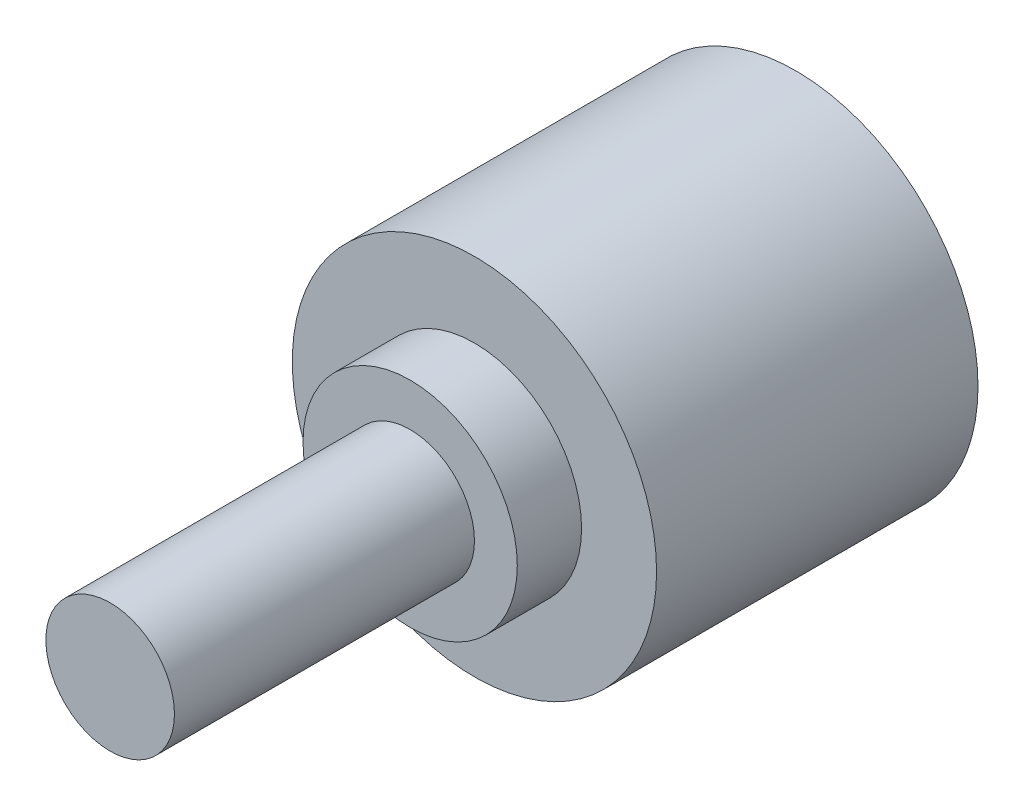
ISO-10303-21;
HEADER;
FILE_DESCRIPTION(('STEP AP214'),'2;1');
FILE_NAME('part.step','',(''),(''),'','','');
FILE_SCHEMA(('AUTOMOTIVE_DESIGN { 1 0 10303 214 1 1 1 1 }'));
ENDSEC;
DATA;
#1=APPLICATION_CONTEXT('core data for automotive mechanical design processes');
#2=APPLICATION_PROTOCOL_DEFINITION('international standard','automotive_design',2000,#1);
#3=PRODUCT_CONTEXT('',#1,'mechanical');
#4=PRODUCT('Part','Part','',(#3));
#5=PRODUCT_RELATED_PRODUCT_CATEGORY('part','',(#4));
#6=PRODUCT_DEFINITION_FORMATION('','',#4);
#7=PRODUCT_DEFINITION_CONTEXT('part definition',#1,'design');
#8=PRODUCT_DEFINITION('design','',#6,#7);
#9=PRODUCT_DEFINITION_SHAPE('','',#8);
#10=(LENGTH_UNIT() NAMED_UNIT(*) SI_UNIT(.MILLI.,.METRE.));
#11=(NAMED_UNIT(*) PLANE_ANGLE_UNIT() SI_UNIT($,.RADIAN.));
#12=(NAMED_UNIT(*) SI_UNIT($,.STERADIAN.) SOLID_ANGLE_UNIT());
#13=UNCERTAINTY_MEASURE_WITH_UNIT(LENGTH_MEASURE(1.E-05),#10,'distance_accuracy_value','');
#14=(GEOMETRIC_REPRESENTATION_CONTEXT(3) GLOBAL_UNCERTAINTY_ASSIGNED_CONTEXT((#13)) GLOBAL_UNIT_ASSIGNED_CONTEXT((#10,
#11,#12)) REPRESENTATION_CONTEXT('',''));
#15=CARTESIAN_POINT('',(0.,0.,0.));
#16=DIRECTION('',(0.,0.,1.));
#17=DIRECTION('',(1.,0.,0.));
#18=AXIS2_PLACEMENT_3D('',#15,#16,#17);
#19=CARTESIAN_POINT('',(0.,0.,14.));
#20=DIRECTION('',(0.,0.,-1.));
#21=DIRECTION('',(-1.,0.,0.));
#22=AXIS2_PLACEMENT_3D('',#19,#20,#21);
#23=CYLINDRICAL_SURFACE('',#22,3.);
#24=CARTESIAN_POINT('',(0.,0.,14.));
#25=DIRECTION('',(0.,0.,1.));
#26=DIRECTION('',(1.,0.,0.));
#27=AXIS2_PLACEMENT_3D('',#24,#25,#26);
#28=CIRCLE('',#27,3.);
#29=CARTESIAN_POINT('',(3.,0.,14.));
#30=VERTEX_POINT('',#29);
#31=EDGE_CURVE('E10',#30,#30,#28,.T.);
#32=ORIENTED_EDGE('',*,*,#31,.F.);
#33=EDGE_LOOP('',(#32));
#34=FACE_BOUND('',#33,.T.);
#35=CARTESIAN_POINT('',(0.,0.,0.));
#36=DIRECTION('',(0.,0.,1.));
#37=DIRECTION('',(1.,0.,0.));
#38=AXIS2_PLACEMENT_3D('',#35,#36,#37);
#39=CIRCLE('',#38,3.);
#40=CARTESIAN_POINT('',(3.,0.,0.));
#41=VERTEX_POINT('',#40);
#42=EDGE_CURVE('E43',#41,#41,#39,.T.);
#43=ORIENTED_EDGE('',*,*,#42,.T.);
#44=EDGE_LOOP('',(#43));
#45=FACE_BOUND('',#44,.T.);
#46=ADVANCED_FACE('F40',(#34,#45),#23,.T.);
#47=CARTESIAN_POINT('',(0.,0.,14.));
#48=DIRECTION('',(0.,0.,1.));
#49=DIRECTION('',(1.,0.,0.));
#50=AXIS2_PLACEMENT_3D('',#47,#48,#49);
#51=PLANE('',#50);
#52=ORIENTED_EDGE('',*,*,#31,.T.);
#53=EDGE_LOOP('',(#52));
#54=FACE_BOUND('',#53,.T.);
#55=ADVANCED_FACE('F80',(#54),#51,.T.);
#56=CARTESIAN_POINT('',(0.,0.,-3.));
#57=DIRECTION('',(0.,0.,1.));
#58=DIRECTION('',(1.,0.,0.));
#59=AXIS2_PLACEMENT_3D('',#56,#57,#58);
#60=CYLINDRICAL_SURFACE('',#59,5.);
#61=CARTESIAN_POINT('',(0.,0.,-3.));
#62=DIRECTION('',(0.,0.,1.));
#63=DIRECTION('',(1.,0.,0.));
#64=AXIS2_PLACEMENT_3D('',#61,#62,#63);
#65=CIRCLE('',#64,5.);
#66=CARTESIAN_POINT('',(5.,0.,-3.));
#67=VERTEX_POINT('',#66);
#68=EDGE_CURVE('E54',#67,#67,#65,.T.);
#69=ORIENTED_EDGE('',*,*,#68,.T.);
#70=EDGE_LOOP('',(#69));
#71=FACE_BOUND('',#70,.T.);
#72=CARTESIAN_POINT('',(0.,0.,0.));
#73=DIRECTION('',(0.,0.,1.));
#74=DIRECTION('',(1.,0.,0.));
#75=AXIS2_PLACEMENT_3D('',#72,#73,#74);
#76=CIRCLE('',#75,5.);
#77=CARTESIAN_POINT('',(5.,0.,0.));
#78=VERTEX_POINT('',#77);
#79=EDGE_CURVE('E50',#78,#78,#76,.T.);
#80=ORIENTED_EDGE('',*,*,#79,.F.);
#81=EDGE_LOOP('',(#80));
#82=FACE_BOUND('',#81,.T.);
#83=ADVANCED_FACE('F85',(#71,#82),#60,.T.);
#84=CARTESIAN_POINT('',(0.,0.,0.));
#85=DIRECTION('',(0.,0.,1.));
#86=DIRECTION('',(1.,0.,0.));
#87=AXIS2_PLACEMENT_3D('',#84,#85,#86);
#88=PLANE('',#87);
#89=ORIENTED_EDGE('',*,*,#42,.F.);
#90=EDGE_LOOP('',(#89));
#91=FACE_BOUND('',#90,.T.);
#92=ORIENTED_EDGE('',*,*,#79,.T.);
#93=EDGE_LOOP('',(#92));
#94=FACE_BOUND('',#93,.T.);
#95=ADVANCED_FACE('F77',(#91,#94),#88,.T.);
#96=CARTESIAN_POINT('',(0.,0.,-18.));
#97=DIRECTION('',(0.,0.,1.));
#98=DIRECTION('',(1.,0.,0.));
#99=AXIS2_PLACEMENT_3D('',#96,#97,#98);
#100=CYLINDRICAL_SURFACE('',#99,8.5);
#101=CARTESIAN_POINT('',(0.,0.,-18.));
#102=DIRECTION('',(0.,0.,1.));
#103=DIRECTION('',(1.,0.,0.));
#104=AXIS2_PLACEMENT_3D('',#101,#102,#103);
#105=CIRCLE('',#104,8.5);
#106=CARTESIAN_POINT('',(8.5,0.,-18.));
#107=VERTEX_POINT('',#106);
#108=EDGE_CURVE('E57',#107,#107,#105,.T.);
#109=ORIENTED_EDGE('',*,*,#108,.T.);
#110=EDGE_LOOP('',(#109));
#111=FACE_BOUND('',#110,.T.);
#112=CARTESIAN_POINT('',(0.,0.,-3.));
#113=DIRECTION('',(0.,0.,1.));
#114=DIRECTION('',(1.,0.,0.));
#115=AXIS2_PLACEMENT_3D('',#112,#113,#114);
#116=CIRCLE('',#115,8.5);
#117=CARTESIAN_POINT('',(8.5,0.,-3.));
#118=VERTEX_POINT('',#117);
#119=EDGE_CURVE('E58',#118,#118,#116,.T.);
#120=ORIENTED_EDGE('',*,*,#119,.F.);
#121=EDGE_LOOP('',(#120));
#122=FACE_BOUND('',#121,.T.);
#123=ADVANCED_FACE('F64',(#111,#122),#100,.T.);
#124=CARTESIAN_POINT('',(0.,0.,-18.));
#125=DIRECTION('',(0.,0.,1.));
#126=DIRECTION('',(1.,0.,0.));
#127=AXIS2_PLACEMENT_3D('',#124,#125,#126);
#128=PLANE('',#127);
#129=ORIENTED_EDGE('',*,*,#108,.F.);
#130=EDGE_LOOP('',(#129));
#131=FACE_BOUND('',#130,.T.);
#132=ADVANCED_FACE('F67',(#131),#128,.F.);
#133=CARTESIAN_POINT('',(0.,0.,-3.));
#134=DIRECTION('',(0.,0.,1.));
#135=DIRECTION('',(1.,0.,0.));
#136=AXIS2_PLACEMENT_3D('',#133,#134,#135);
#137=PLANE('',#136);
#138=ORIENTED_EDGE('',*,*,#68,.F.);
#139=EDGE_LOOP('',(#138));
#140=FACE_BOUND('',#139,.T.);
#141=ORIENTED_EDGE('',*,*,#119,.T.);
#142=EDGE_LOOP('',(#141));
#143=FACE_BOUND('',#142,.T.);
#144=ADVANCED_FACE('F69',(#140,#143),#137,.T.);
#145=CLOSED_SHELL('',(#46,#55,#83,#95,#123,#132,#144));
#146=MANIFOLD_SOLID_BREP('B2',#145);
#147=ADVANCED_BREP_SHAPE_REPRESENTATION('',(#18,#146),#14);
#148=SHAPE_DEFINITION_REPRESENTATION(#9,#147);
ENDSEC;
END-ISO-10303-21;
